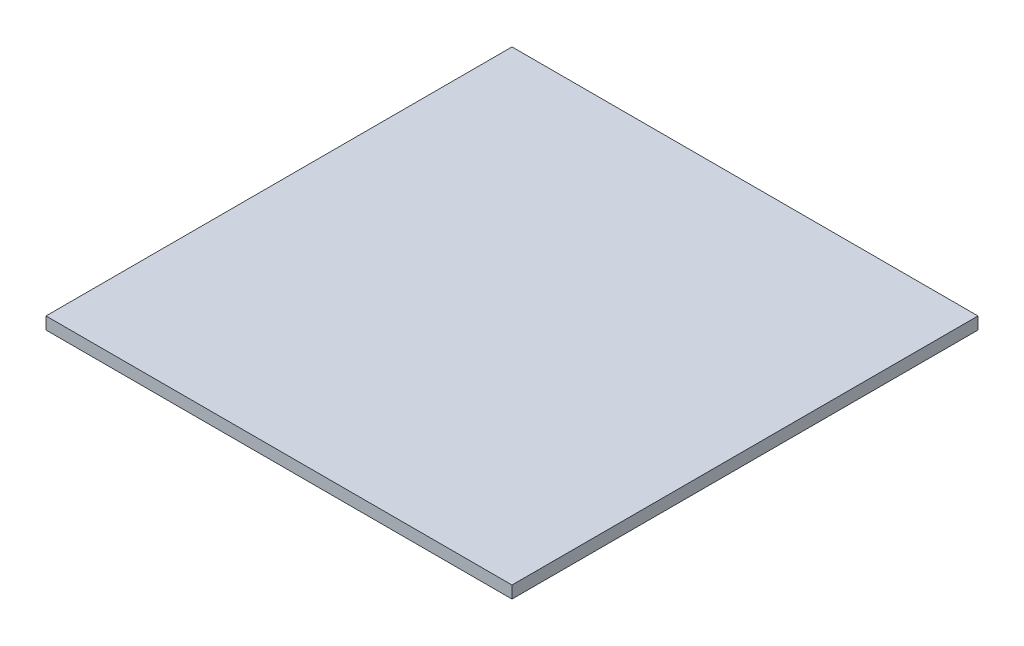
ISO-10303-21;
HEADER;
FILE_DESCRIPTION(('STEP AP214'),'2;1');
FILE_NAME('part.step','',(''),(''),'','','');
FILE_SCHEMA(('AUTOMOTIVE_DESIGN { 1 0 10303 214 1 1 1 1 }'));
ENDSEC;
DATA;
#1=APPLICATION_CONTEXT('core data for automotive mechanical design processes');
#2=APPLICATION_PROTOCOL_DEFINITION('international standard','automotive_design',2000,#1);
#3=PRODUCT_CONTEXT('',#1,'mechanical');
#4=PRODUCT('Part','Part','',(#3));
#5=PRODUCT_RELATED_PRODUCT_CATEGORY('part','',(#4));
#6=PRODUCT_DEFINITION_FORMATION('','',#4);
#7=PRODUCT_DEFINITION_CONTEXT('part definition',#1,'design');
#8=PRODUCT_DEFINITION('design','',#6,#7);
#9=PRODUCT_DEFINITION_SHAPE('','',#8);
#10=(LENGTH_UNIT() NAMED_UNIT(*) SI_UNIT(.MILLI.,.METRE.));
#11=(NAMED_UNIT(*) PLANE_ANGLE_UNIT() SI_UNIT($,.RADIAN.));
#12=(NAMED_UNIT(*) SI_UNIT($,.STERADIAN.) SOLID_ANGLE_UNIT());
#13=UNCERTAINTY_MEASURE_WITH_UNIT(LENGTH_MEASURE(1.E-05),#10,'distance_accuracy_value','');
#14=(GEOMETRIC_REPRESENTATION_CONTEXT(3) GLOBAL_UNCERTAINTY_ASSIGNED_CONTEXT((#13)) GLOBAL_UNIT_ASSIGNED_CONTEXT((#10,
#11,#12)) REPRESENTATION_CONTEXT('',''));
#15=CARTESIAN_POINT('',(0.,0.,0.));
#16=DIRECTION('',(0.,0.,1.));
#17=DIRECTION('',(1.,0.,0.));
#18=AXIS2_PLACEMENT_3D('',#15,#16,#17);
#19=CARTESIAN_POINT('',(38.1,2.,-38.1));
#20=DIRECTION('',(-1.,0.,0.));
#21=DIRECTION('',(0.,0.,1.));
#22=AXIS2_PLACEMENT_3D('',#19,#20,#21);
#23=PLANE('',#22);
#24=DIRECTION('',(0.,0.,-1.));
#25=VECTOR('',#24,1.);
#26=CARTESIAN_POINT('',(38.1,0.,-38.1));
#27=LINE('',#26,#25);
#28=CARTESIAN_POINT('',(38.1,0.,38.1));
#29=VERTEX_POINT('',#28);
#30=CARTESIAN_POINT('',(38.1,0.,-38.1));
#31=VERTEX_POINT('',#30);
#32=EDGE_CURVE('E102',#29,#31,#27,.T.);
#33=ORIENTED_EDGE('',*,*,#32,.T.);
#34=DIRECTION('',(0.,-1.,0.));
#35=VECTOR('',#34,1.);
#36=CARTESIAN_POINT('',(38.1,2.,-38.1));
#37=LINE('',#36,#35);
#38=CARTESIAN_POINT('',(38.1,2.,-38.1));
#39=VERTEX_POINT('',#38);
#40=EDGE_CURVE('E11',#39,#31,#37,.T.);
#41=ORIENTED_EDGE('',*,*,#40,.F.);
#42=DIRECTION('',(0.,0.,-1.));
#43=VECTOR('',#42,1.);
#44=CARTESIAN_POINT('',(38.1,2.,-38.1));
#45=LINE('',#44,#43);
#46=CARTESIAN_POINT('',(38.1,2.,38.1));
#47=VERTEX_POINT('',#46);
#48=EDGE_CURVE('E90',#47,#39,#45,.T.);
#49=ORIENTED_EDGE('',*,*,#48,.F.);
#50=DIRECTION('',(0.,-1.,0.));
#51=VECTOR('',#50,1.);
#52=CARTESIAN_POINT('',(38.1,2.,38.1));
#53=LINE('',#52,#51);
#54=EDGE_CURVE('E98',#47,#29,#53,.T.);
#55=ORIENTED_EDGE('',*,*,#54,.T.);
#56=EDGE_LOOP('',(#33,#41,#49,#55));
#57=FACE_BOUND('',#56,.T.);
#58=ADVANCED_FACE('F39',(#57),#23,.F.);
#59=CARTESIAN_POINT('',(-38.1,2.,-38.1));
#60=DIRECTION('',(0.,0.,1.));
#61=DIRECTION('',(1.,0.,0.));
#62=AXIS2_PLACEMENT_3D('',#59,#60,#61);
#63=PLANE('',#62);
#64=DIRECTION('',(-1.,0.,0.));
#65=VECTOR('',#64,1.);
#66=CARTESIAN_POINT('',(-38.1,0.,-38.1));
#67=LINE('',#66,#65);
#68=CARTESIAN_POINT('',(-38.1,0.,-38.1));
#69=VERTEX_POINT('',#68);
#70=EDGE_CURVE('E94',#31,#69,#67,.T.);
#71=ORIENTED_EDGE('',*,*,#70,.T.);
#72=DIRECTION('',(0.,-1.,0.));
#73=VECTOR('',#72,1.);
#74=CARTESIAN_POINT('',(-38.1,2.,-38.1));
#75=LINE('',#74,#73);
#76=CARTESIAN_POINT('',(-38.1,2.,-38.1));
#77=VERTEX_POINT('',#76);
#78=EDGE_CURVE('E47',#77,#69,#75,.T.);
#79=ORIENTED_EDGE('',*,*,#78,.F.);
#80=DIRECTION('',(-1.,0.,0.));
#81=VECTOR('',#80,1.);
#82=CARTESIAN_POINT('',(-38.1,2.,-38.1));
#83=LINE('',#82,#81);
#84=EDGE_CURVE('E85',#39,#77,#83,.T.);
#85=ORIENTED_EDGE('',*,*,#84,.F.);
#86=ORIENTED_EDGE('',*,*,#40,.T.);
#87=EDGE_LOOP('',(#71,#79,#85,#86));
#88=FACE_BOUND('',#87,.T.);
#89=ADVANCED_FACE('F93',(#88),#63,.F.);
#90=CARTESIAN_POINT('',(-38.1,2.,-38.1));
#91=DIRECTION('',(1.,0.,0.));
#92=DIRECTION('',(0.,0.,-1.));
#93=AXIS2_PLACEMENT_3D('',#90,#91,#92);
#94=PLANE('',#93);
#95=DIRECTION('',(0.,0.,1.));
#96=VECTOR('',#95,1.);
#97=CARTESIAN_POINT('',(-38.1,0.,-38.1));
#98=LINE('',#97,#96);
#99=CARTESIAN_POINT('',(-38.1,0.,38.1));
#100=VERTEX_POINT('',#99);
#101=EDGE_CURVE('E72',#69,#100,#98,.T.);
#102=ORIENTED_EDGE('',*,*,#101,.T.);
#103=DIRECTION('',(0.,-1.,0.));
#104=VECTOR('',#103,1.);
#105=CARTESIAN_POINT('',(-38.1,2.,38.1));
#106=LINE('',#105,#104);
#107=CARTESIAN_POINT('',(-38.1,2.,38.1));
#108=VERTEX_POINT('',#107);
#109=EDGE_CURVE('E95',#108,#100,#106,.T.);
#110=ORIENTED_EDGE('',*,*,#109,.F.);
#111=DIRECTION('',(0.,0.,1.));
#112=VECTOR('',#111,1.);
#113=CARTESIAN_POINT('',(-38.1,2.,-38.1));
#114=LINE('',#113,#112);
#115=EDGE_CURVE('E88',#77,#108,#114,.T.);
#116=ORIENTED_EDGE('',*,*,#115,.F.);
#117=ORIENTED_EDGE('',*,*,#78,.T.);
#118=EDGE_LOOP('',(#102,#110,#116,#117));
#119=FACE_BOUND('',#118,.T.);
#120=ADVANCED_FACE('F96',(#119),#94,.F.);
#121=CARTESIAN_POINT('',(-38.1,2.,38.1));
#122=DIRECTION('',(0.,0.,-1.));
#123=DIRECTION('',(-1.,0.,0.));
#124=AXIS2_PLACEMENT_3D('',#121,#122,#123);
#125=PLANE('',#124);
#126=DIRECTION('',(1.,0.,0.));
#127=VECTOR('',#126,1.);
#128=CARTESIAN_POINT('',(-38.1,0.,38.1));
#129=LINE('',#128,#127);
#130=EDGE_CURVE('E78',#100,#29,#129,.T.);
#131=ORIENTED_EDGE('',*,*,#130,.T.);
#132=ORIENTED_EDGE('',*,*,#54,.F.);
#133=DIRECTION('',(1.,0.,0.));
#134=VECTOR('',#133,1.);
#135=CARTESIAN_POINT('',(-38.1,2.,38.1));
#136=LINE('',#135,#134);
#137=EDGE_CURVE('E55',#108,#47,#136,.T.);
#138=ORIENTED_EDGE('',*,*,#137,.F.);
#139=ORIENTED_EDGE('',*,*,#109,.T.);
#140=EDGE_LOOP('',(#131,#132,#138,#139));
#141=FACE_BOUND('',#140,.T.);
#142=ADVANCED_FACE('F109',(#141),#125,.F.);
#143=CARTESIAN_POINT('',(0.,2.,0.));
#144=DIRECTION('',(0.,1.,0.));
#145=DIRECTION('',(0.,0.,1.));
#146=AXIS2_PLACEMENT_3D('',#143,#144,#145);
#147=PLANE('',#146);
#148=ORIENTED_EDGE('',*,*,#48,.T.);
#149=ORIENTED_EDGE('',*,*,#84,.T.);
#150=ORIENTED_EDGE('',*,*,#115,.T.);
#151=ORIENTED_EDGE('',*,*,#137,.T.);
#152=EDGE_LOOP('',(#148,#149,#150,#151));
#153=FACE_BOUND('',#152,.T.);
#154=ADVANCED_FACE('F86',(#153),#147,.T.);
#155=CARTESIAN_POINT('',(0.,0.,0.));
#156=DIRECTION('',(0.,1.,0.));
#157=DIRECTION('',(0.,0.,1.));
#158=AXIS2_PLACEMENT_3D('',#155,#156,#157);
#159=PLANE('',#158);
#160=ORIENTED_EDGE('',*,*,#32,.F.);
#161=ORIENTED_EDGE('',*,*,#130,.F.);
#162=ORIENTED_EDGE('',*,*,#101,.F.);
#163=ORIENTED_EDGE('',*,*,#70,.F.);
#164=EDGE_LOOP('',(#160,#161,#162,#163));
#165=FACE_BOUND('',#164,.T.);
#166=ADVANCED_FACE('F112',(#165),#159,.F.);
#167=CLOSED_SHELL('',(#58,#89,#120,#142,#154,#166));
#168=MANIFOLD_SOLID_BREP('B2',#167);
#169=ADVANCED_BREP_SHAPE_REPRESENTATION('',(#18,#168),#14);
#170=SHAPE_DEFINITION_REPRESENTATION(#9,#169);
ENDSEC;
END-ISO-10303-21;
